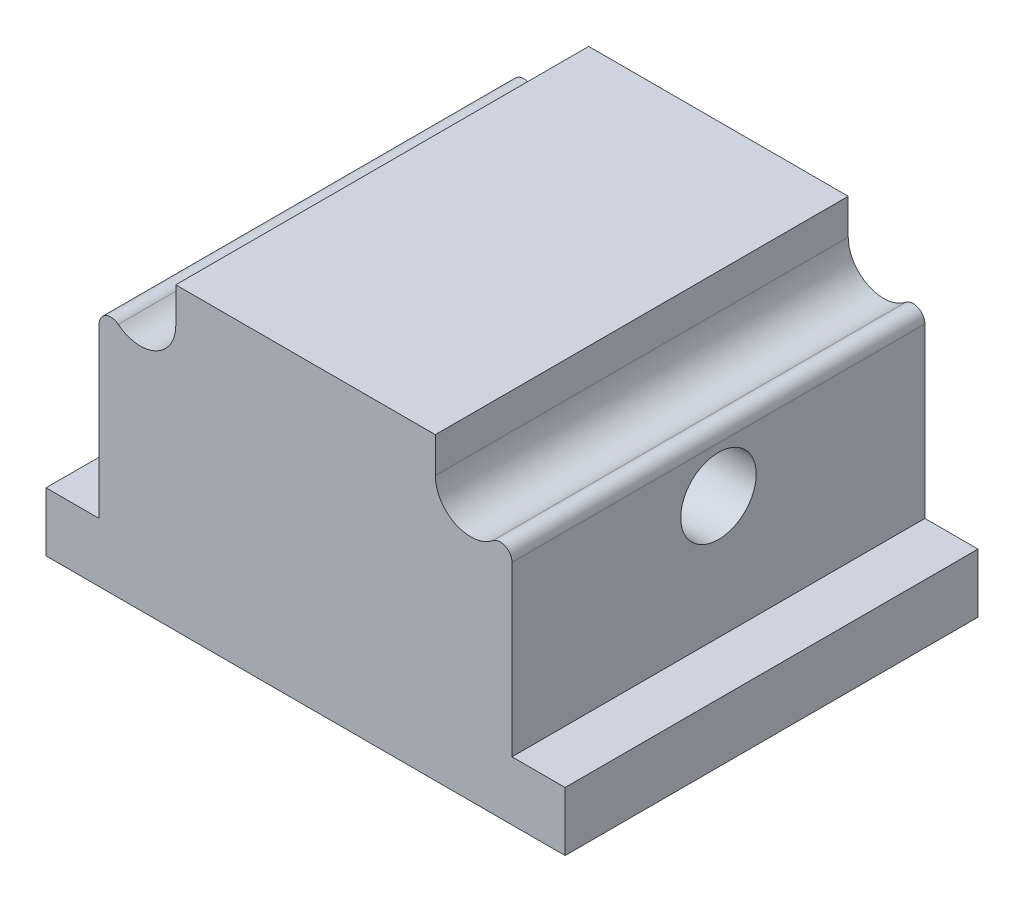
ISO-10303-21;
HEADER;
FILE_DESCRIPTION(('STEP AP214'),'2;1');
FILE_NAME('part.step','',(''),(''),'','','');
FILE_SCHEMA(('AUTOMOTIVE_DESIGN { 1 0 10303 214 1 1 1 1 }'));
ENDSEC;
DATA;
#1=APPLICATION_CONTEXT('core data for automotive mechanical design processes');
#2=APPLICATION_PROTOCOL_DEFINITION('international standard','automotive_design',2000,#1);
#3=PRODUCT_CONTEXT('',#1,'mechanical');
#4=PRODUCT('Part','Part','',(#3));
#5=PRODUCT_RELATED_PRODUCT_CATEGORY('part','',(#4));
#6=PRODUCT_DEFINITION_FORMATION('','',#4);
#7=PRODUCT_DEFINITION_CONTEXT('part definition',#1,'design');
#8=PRODUCT_DEFINITION('design','',#6,#7);
#9=PRODUCT_DEFINITION_SHAPE('','',#8);
#10=(LENGTH_UNIT() NAMED_UNIT(*) SI_UNIT(.MILLI.,.METRE.));
#11=(NAMED_UNIT(*) PLANE_ANGLE_UNIT() SI_UNIT($,.RADIAN.));
#12=(NAMED_UNIT(*) SI_UNIT($,.STERADIAN.) SOLID_ANGLE_UNIT());
#13=UNCERTAINTY_MEASURE_WITH_UNIT(LENGTH_MEASURE(1.E-05),#10,'distance_accuracy_value','');
#14=(GEOMETRIC_REPRESENTATION_CONTEXT(3) GLOBAL_UNCERTAINTY_ASSIGNED_CONTEXT((#13)) GLOBAL_UNIT_ASSIGNED_CONTEXT((#10,
#11,#12)) REPRESENTATION_CONTEXT('',''));
#15=CARTESIAN_POINT('',(0.,0.,0.));
#16=DIRECTION('',(0.,0.,1.));
#17=DIRECTION('',(1.,0.,0.));
#18=AXIS2_PLACEMENT_3D('',#15,#16,#17);
#19=CARTESIAN_POINT('',(0.,-7.7,0.));
#20=DIRECTION('',(0.,-1.,0.));
#21=DIRECTION('',(0.,0.,-1.));
#22=AXIS2_PLACEMENT_3D('',#19,#20,#21);
#23=PLANE('',#22);
#24=DIRECTION('',(0.,0.,1.));
#25=VECTOR('',#24,1.);
#26=CARTESIAN_POINT('',(11.,-7.7,8.75));
#27=LINE('',#26,#25);
#28=CARTESIAN_POINT('',(11.,-7.7,-8.75));
#29=VERTEX_POINT('',#28);
#30=CARTESIAN_POINT('',(11.,-7.7,8.75));
#31=VERTEX_POINT('',#30);
#32=EDGE_CURVE('E278',#29,#31,#27,.T.);
#33=ORIENTED_EDGE('',*,*,#32,.T.);
#34=DIRECTION('',(-1.,0.,0.));
#35=VECTOR('',#34,1.);
#36=CARTESIAN_POINT('',(-11.,-7.7,8.75));
#37=LINE('',#36,#35);
#38=CARTESIAN_POINT('',(-11.,-7.7,8.75));
#39=VERTEX_POINT('',#38);
#40=EDGE_CURVE('E281',#31,#39,#37,.T.);
#41=ORIENTED_EDGE('',*,*,#40,.T.);
#42=DIRECTION('',(0.,0.,-1.));
#43=VECTOR('',#42,1.);
#44=CARTESIAN_POINT('',(-11.,-7.7,8.75));
#45=LINE('',#44,#43);
#46=CARTESIAN_POINT('',(-11.,-7.7,-8.75));
#47=VERTEX_POINT('',#46);
#48=EDGE_CURVE('E284',#39,#47,#45,.T.);
#49=ORIENTED_EDGE('',*,*,#48,.T.);
#50=DIRECTION('',(1.,0.,0.));
#51=VECTOR('',#50,1.);
#52=CARTESIAN_POINT('',(-11.,-7.7,-8.75));
#53=LINE('',#52,#51);
#54=EDGE_CURVE('E286',#47,#29,#53,.T.);
#55=ORIENTED_EDGE('',*,*,#54,.T.);
#56=EDGE_LOOP('',(#33,#41,#49,#55));
#57=FACE_BOUND('',#56,.T.);
#58=DIRECTION('',(0.951056516295154,0.,-0.309016994374947));
#59=VECTOR('',#58,1.);
#60=CARTESIAN_POINT('',(-0.763932022500211,-7.7,-2.35114100916989));
#61=LINE('',#60,#59);
#62=CARTESIAN_POINT('',(-8.,-7.7,0.));
#63=VERTEX_POINT('',#62);
#64=CARTESIAN_POINT('',(-2.47213595499958,-7.7,-1.79611190631834));
#65=VERTEX_POINT('',#64);
#66=EDGE_CURVE('E235',#63,#65,#61,.T.);
#67=ORIENTED_EDGE('',*,*,#66,.F.);
#68=DIRECTION('',(0.951056516295154,0.,0.309016994374948));
#69=VECTOR('',#68,1.);
#70=CARTESIAN_POINT('',(-0.763932022500211,-7.7,2.35114100916989));
#71=LINE('',#70,#69);
#72=CARTESIAN_POINT('',(-2.47213595499958,-7.7,1.79611190631834));
#73=VERTEX_POINT('',#72);
#74=EDGE_CURVE('E50',#63,#73,#71,.T.);
#75=ORIENTED_EDGE('',*,*,#74,.T.);
#76=DIRECTION('',(0.,0.,-1.));
#77=VECTOR('',#76,1.);
#78=CARTESIAN_POINT('',(-2.47213595499958,-7.7,0.));
#79=LINE('',#78,#77);
#80=CARTESIAN_POINT('',(-2.47213595499958,-7.7,7.60845213036123));
#81=VERTEX_POINT('',#80);
#82=EDGE_CURVE('E212',#81,#73,#79,.T.);
#83=ORIENTED_EDGE('',*,*,#82,.F.);
#84=DIRECTION('',(0.587785252292473,0.,-0.809016994374947));
#85=VECTOR('',#84,1.);
#86=CARTESIAN_POINT('',(2.,-7.7,1.45308505601072));
#87=LINE('',#86,#85);
#88=CARTESIAN_POINT('',(0.94427190999916,-7.7,2.90617011202144));
#89=VERTEX_POINT('',#88);
#90=EDGE_CURVE('E255',#81,#89,#87,.T.);
#91=ORIENTED_EDGE('',*,*,#90,.T.);
#92=DIRECTION('',(0.951056516295154,0.,0.309016994374948));
#93=VECTOR('',#92,1.);
#94=CARTESIAN_POINT('',(-0.763932022500211,-7.7,2.35114100916989));
#95=LINE('',#94,#93);
#96=CARTESIAN_POINT('',(6.47213595499958,-7.7,4.70228201833979));
#97=VERTEX_POINT('',#96);
#98=EDGE_CURVE('E252',#89,#97,#95,.T.);
#99=ORIENTED_EDGE('',*,*,#98,.T.);
#100=DIRECTION('',(-0.587785252292473,0.,-0.809016994374948));
#101=VECTOR('',#100,1.);
#102=CARTESIAN_POINT('',(2.,-7.7,-1.45308505601072));
#103=LINE('',#102,#101);
#104=CARTESIAN_POINT('',(3.05572809000084,-7.7,0.));
#105=VERTEX_POINT('',#104);
#106=EDGE_CURVE('E249',#97,#105,#103,.T.);
#107=ORIENTED_EDGE('',*,*,#106,.T.);
#108=DIRECTION('',(0.587785252292473,0.,-0.809016994374947));
#109=VECTOR('',#108,1.);
#110=CARTESIAN_POINT('',(2.,-7.7,1.45308505601072));
#111=LINE('',#110,#109);
#112=CARTESIAN_POINT('',(6.47213595499958,-7.7,-4.70228201833979));
#113=VERTEX_POINT('',#112);
#114=EDGE_CURVE('E246',#105,#113,#111,.T.);
#115=ORIENTED_EDGE('',*,*,#114,.T.);
#116=DIRECTION('',(0.951056516295154,0.,-0.309016994374947));
#117=VECTOR('',#116,1.);
#118=CARTESIAN_POINT('',(-0.763932022500211,-7.7,-2.35114100916989));
#119=LINE('',#118,#117);
#120=CARTESIAN_POINT('',(0.944271909999159,-7.7,-2.90617011202144));
#121=VERTEX_POINT('',#120);
#122=EDGE_CURVE('E243',#121,#113,#119,.T.);
#123=ORIENTED_EDGE('',*,*,#122,.F.);
#124=DIRECTION('',(-0.587785252292473,0.,-0.809016994374948));
#125=VECTOR('',#124,1.);
#126=CARTESIAN_POINT('',(2.,-7.7,-1.45308505601072));
#127=LINE('',#126,#125);
#128=CARTESIAN_POINT('',(-2.47213595499958,-7.7,-7.60845213036123));
#129=VERTEX_POINT('',#128);
#130=EDGE_CURVE('E240',#121,#129,#127,.T.);
#131=ORIENTED_EDGE('',*,*,#130,.T.);
#132=DIRECTION('',(0.,0.,-1.));
#133=VECTOR('',#132,1.);
#134=CARTESIAN_POINT('',(-2.47213595499958,-7.7,0.));
#135=LINE('',#134,#133);
#136=EDGE_CURVE('E237',#65,#129,#135,.T.);
#137=ORIENTED_EDGE('',*,*,#136,.F.);
#138=EDGE_LOOP('',(#67,#75,#83,#91,#99,#107,#115,#123,#131,#137));
#139=FACE_BOUND('',#138,.T.);
#140=ADVANCED_FACE('F35',(#57,#139),#23,.T.);
#141=CARTESIAN_POINT('',(-8.75,5.,8.75000000000001));
#142=DIRECTION('',(1.,0.,0.));
#143=DIRECTION('',(0.,0.,-1.));
#144=AXIS2_PLACEMENT_3D('',#141,#142,#143);
#145=PLANE('',#144);
#146=CARTESIAN_POINT('',(-8.75000000000001,0.,0.));
#147=DIRECTION('',(1.,0.,0.));
#148=DIRECTION('',(0.,0.,-1.));
#149=AXIS2_PLACEMENT_3D('',#146,#147,#148);
#150=CIRCLE('',#149,1.6);
#151=CARTESIAN_POINT('',(-8.75000000000001,0.,-1.6));
#152=VERTEX_POINT('',#151);
#153=EDGE_CURVE('E368',#152,#152,#150,.T.);
#154=ORIENTED_EDGE('',*,*,#153,.T.);
#155=EDGE_LOOP('',(#154));
#156=FACE_BOUND('',#155,.T.);
#157=DIRECTION('',(0.,0.,-1.));
#158=VECTOR('',#157,1.);
#159=CARTESIAN_POINT('',(-8.75,1.9387505004004,8.75000000000001));
#160=LINE('',#159,#158);
#161=CARTESIAN_POINT('',(-8.75,1.9387505004004,8.75000000000001));
#162=VERTEX_POINT('',#161);
#163=CARTESIAN_POINT('',(-8.75000000000001,1.9387505004004,-8.75));
#164=VERTEX_POINT('',#163);
#165=EDGE_CURVE('E335',#162,#164,#160,.T.);
#166=ORIENTED_EDGE('',*,*,#165,.T.);
#167=DIRECTION('',(0.,-1.,0.));
#168=VECTOR('',#167,1.);
#169=CARTESIAN_POINT('',(-8.75000000000001,5.,-8.75));
#170=LINE('',#169,#168);
#171=CARTESIAN_POINT('',(-8.75,-5.2,-8.75));
#172=VERTEX_POINT('',#171);
#173=EDGE_CURVE('E43',#164,#172,#170,.T.);
#174=ORIENTED_EDGE('',*,*,#173,.T.);
#175=DIRECTION('',(0.,0.,-1.));
#176=VECTOR('',#175,1.);
#177=CARTESIAN_POINT('',(-8.75,-5.2,8.75000000000001));
#178=LINE('',#177,#176);
#179=CARTESIAN_POINT('',(-8.75,-5.2,8.75000000000001));
#180=VERTEX_POINT('',#179);
#181=EDGE_CURVE('E314',#180,#172,#178,.T.);
#182=ORIENTED_EDGE('',*,*,#181,.F.);
#183=DIRECTION('',(0.,-1.,0.));
#184=VECTOR('',#183,1.);
#185=CARTESIAN_POINT('',(-8.75,5.,8.75000000000001));
#186=LINE('',#185,#184);
#187=EDGE_CURVE('E381',#162,#180,#186,.T.);
#188=ORIENTED_EDGE('',*,*,#187,.F.);
#189=EDGE_LOOP('',(#166,#174,#182,#188));
#190=FACE_BOUND('',#189,.T.);
#191=ADVANCED_FACE('F385',(#156,#190),#145,.F.);
#192=CARTESIAN_POINT('',(8.75000000000001,5.,8.75));
#193=DIRECTION('',(-1.,0.,0.));
#194=DIRECTION('',(0.,0.,1.));
#195=AXIS2_PLACEMENT_3D('',#192,#193,#194);
#196=PLANE('',#195);
#197=CARTESIAN_POINT('',(8.75,0.,0.));
#198=DIRECTION('',(1.,0.,0.));
#199=DIRECTION('',(0.,0.,-1.));
#200=AXIS2_PLACEMENT_3D('',#197,#198,#199);
#201=CIRCLE('',#200,1.6);
#202=CARTESIAN_POINT('',(8.75,0.,-1.6));
#203=VERTEX_POINT('',#202);
#204=EDGE_CURVE('E338',#203,#203,#201,.T.);
#205=ORIENTED_EDGE('',*,*,#204,.F.);
#206=EDGE_LOOP('',(#205));
#207=FACE_BOUND('',#206,.T.);
#208=DIRECTION('',(0.,-1.,0.));
#209=VECTOR('',#208,1.);
#210=CARTESIAN_POINT('',(8.75,5.,-8.75));
#211=LINE('',#210,#209);
#212=CARTESIAN_POINT('',(8.75,1.9387505004004,-8.75000000000001));
#213=VERTEX_POINT('',#212);
#214=CARTESIAN_POINT('',(8.75,-5.2,-8.75));
#215=VERTEX_POINT('',#214);
#216=EDGE_CURVE('E11',#213,#215,#211,.T.);
#217=ORIENTED_EDGE('',*,*,#216,.F.);
#218=DIRECTION('',(0.,0.,-1.));
#219=VECTOR('',#218,1.);
#220=CARTESIAN_POINT('',(8.75000000000001,1.9387505004004,8.75000000000001));
#221=LINE('',#220,#219);
#222=CARTESIAN_POINT('',(8.75000000000001,1.9387505004004,8.75000000000001));
#223=VERTEX_POINT('',#222);
#224=EDGE_CURVE('E331',#223,#213,#221,.T.);
#225=ORIENTED_EDGE('',*,*,#224,.F.);
#226=DIRECTION('',(0.,-1.,0.));
#227=VECTOR('',#226,1.);
#228=CARTESIAN_POINT('',(8.75000000000001,5.,8.75));
#229=LINE('',#228,#227);
#230=CARTESIAN_POINT('',(8.75000000000001,-5.2,8.75));
#231=VERTEX_POINT('',#230);
#232=EDGE_CURVE('E379',#223,#231,#229,.T.);
#233=ORIENTED_EDGE('',*,*,#232,.T.);
#234=DIRECTION('',(0.,0.,1.));
#235=VECTOR('',#234,1.);
#236=CARTESIAN_POINT('',(8.75,-5.2,-8.75));
#237=LINE('',#236,#235);
#238=EDGE_CURVE('E311',#215,#231,#237,.T.);
#239=ORIENTED_EDGE('',*,*,#238,.F.);
#240=EDGE_LOOP('',(#217,#225,#233,#239));
#241=FACE_BOUND('',#240,.T.);
#242=ADVANCED_FACE('F37',(#207,#241),#196,.F.);
#243=CARTESIAN_POINT('',(-8.75000000000001,5.,-8.75));
#244=DIRECTION('',(0.,0.,1.));
#245=DIRECTION('',(1.,0.,0.));
#246=AXIS2_PLACEMENT_3D('',#243,#244,#245);
#247=PLANE('',#246);
#248=ORIENTED_EDGE('',*,*,#173,.F.);
#249=CARTESIAN_POINT('',(-8.25,1.9387505004004,-8.75));
#250=DIRECTION('',(0.,0.,1.));
#251=DIRECTION('',(1.,0.,0.));
#252=AXIS2_PLACEMENT_3D('',#249,#250,#251);
#253=CIRCLE('',#252,0.500000000000002);
#254=CARTESIAN_POINT('',(-7.9375,2.3290628753003,-8.75));
#255=VERTEX_POINT('',#254);
#256=EDGE_CURVE('E320',#255,#164,#253,.T.);
#257=ORIENTED_EDGE('',*,*,#256,.F.);
#258=CARTESIAN_POINT('',(-7.,3.5,-8.75));
#259=DIRECTION('',(0.,0.,-1.));
#260=DIRECTION('',(-1.,0.,0.));
#261=AXIS2_PLACEMENT_3D('',#258,#259,#260);
#262=CIRCLE('',#261,1.5);
#263=CARTESIAN_POINT('',(-5.5,3.5,-8.75));
#264=VERTEX_POINT('',#263);
#265=EDGE_CURVE('E330',#264,#255,#262,.T.);
#266=ORIENTED_EDGE('',*,*,#265,.F.);
#267=DIRECTION('',(0.,-1.,0.));
#268=VECTOR('',#267,1.);
#269=CARTESIAN_POINT('',(-5.5,3.5,-8.75));
#270=LINE('',#269,#268);
#271=CARTESIAN_POINT('',(-5.5,5.,-8.75));
#272=VERTEX_POINT('',#271);
#273=EDGE_CURVE('E327',#272,#264,#270,.T.);
#274=ORIENTED_EDGE('',*,*,#273,.F.);
#275=DIRECTION('',(-1.,0.,0.));
#276=VECTOR('',#275,1.);
#277=CARTESIAN_POINT('',(-8.75000000000001,5.,-8.75));
#278=LINE('',#277,#276);
#279=CARTESIAN_POINT('',(5.5,5.,-8.75));
#280=VERTEX_POINT('',#279);
#281=EDGE_CURVE('E371',#280,#272,#278,.T.);
#282=ORIENTED_EDGE('',*,*,#281,.F.);
#283=DIRECTION('',(0.,1.,0.));
#284=VECTOR('',#283,1.);
#285=CARTESIAN_POINT('',(5.5,3.5,-8.75));
#286=LINE('',#285,#284);
#287=CARTESIAN_POINT('',(5.5,3.5,-8.75));
#288=VERTEX_POINT('',#287);
#289=EDGE_CURVE('E348',#288,#280,#286,.T.);
#290=ORIENTED_EDGE('',*,*,#289,.F.);
#291=CARTESIAN_POINT('',(7.,3.5,-8.75));
#292=DIRECTION('',(0.,0.,-1.));
#293=DIRECTION('',(1.,0.,0.));
#294=AXIS2_PLACEMENT_3D('',#291,#292,#293);
#295=CIRCLE('',#294,1.5);
#296=CARTESIAN_POINT('',(7.9375,2.3290628753003,-8.75));
#297=VERTEX_POINT('',#296);
#298=EDGE_CURVE('E357',#297,#288,#295,.T.);
#299=ORIENTED_EDGE('',*,*,#298,.F.);
#300=CARTESIAN_POINT('',(8.25,1.9387505004004,-8.75));
#301=DIRECTION('',(0.,0.,1.));
#302=DIRECTION('',(-1.,0.,0.));
#303=AXIS2_PLACEMENT_3D('',#300,#301,#302);
#304=CIRCLE('',#303,0.500000000000002);
#305=EDGE_CURVE('E317',#213,#297,#304,.T.);
#306=ORIENTED_EDGE('',*,*,#305,.F.);
#307=ORIENTED_EDGE('',*,*,#216,.T.);
#308=DIRECTION('',(1.,0.,0.));
#309=VECTOR('',#308,1.);
#310=CARTESIAN_POINT('',(-11.,-5.2,-8.75));
#311=LINE('',#310,#309);
#312=CARTESIAN_POINT('',(11.,-5.2,-8.75));
#313=VERTEX_POINT('',#312);
#314=EDGE_CURVE('E297',#215,#313,#311,.T.);
#315=ORIENTED_EDGE('',*,*,#314,.T.);
#316=DIRECTION('',(0.,1.,0.));
#317=VECTOR('',#316,1.);
#318=CARTESIAN_POINT('',(11.,-7.7,-8.75));
#319=LINE('',#318,#317);
#320=EDGE_CURVE('E288',#29,#313,#319,.T.);
#321=ORIENTED_EDGE('',*,*,#320,.F.);
#322=ORIENTED_EDGE('',*,*,#54,.F.);
#323=DIRECTION('',(0.,1.,0.));
#324=VECTOR('',#323,1.);
#325=CARTESIAN_POINT('',(-11.,-7.7,-8.75));
#326=LINE('',#325,#324);
#327=CARTESIAN_POINT('',(-11.,-5.2,-8.75));
#328=VERTEX_POINT('',#327);
#329=EDGE_CURVE('E302',#47,#328,#326,.T.);
#330=ORIENTED_EDGE('',*,*,#329,.T.);
#331=EDGE_CURVE('E282',#328,#172,#311,.T.);
#332=ORIENTED_EDGE('',*,*,#331,.T.);
#333=EDGE_LOOP('',(#248,#257,#266,#274,#282,#290,#299,#306,#307,#315,#321,#322,#330,#332));
#334=FACE_BOUND('',#333,.T.);
#335=ADVANCED_FACE('F394',(#334),#247,.F.);
#336=CARTESIAN_POINT('',(-8.75,5.,8.75000000000001));
#337=DIRECTION('',(0.,0.,-1.));
#338=DIRECTION('',(-1.,0.,0.));
#339=AXIS2_PLACEMENT_3D('',#336,#337,#338);
#340=PLANE('',#339);
#341=CARTESIAN_POINT('',(-7.,3.5,8.75000000000001));
#342=DIRECTION('',(0.,0.,-1.));
#343=DIRECTION('',(-1.,0.,0.));
#344=AXIS2_PLACEMENT_3D('',#341,#342,#343);
#345=CIRCLE('',#344,1.5);
#346=CARTESIAN_POINT('',(-5.5,3.5,8.75000000000001));
#347=VERTEX_POINT('',#346);
#348=CARTESIAN_POINT('',(-7.9375,2.3290628753003,8.75000000000001));
#349=VERTEX_POINT('',#348);
#350=EDGE_CURVE('E319',#347,#349,#345,.T.);
#351=ORIENTED_EDGE('',*,*,#350,.T.);
#352=CARTESIAN_POINT('',(-8.25,1.9387505004004,8.75000000000001));
#353=DIRECTION('',(0.,0.,1.));
#354=DIRECTION('',(1.,0.,0.));
#355=AXIS2_PLACEMENT_3D('',#352,#353,#354);
#356=CIRCLE('',#355,0.500000000000002);
#357=EDGE_CURVE('E323',#349,#162,#356,.T.);
#358=ORIENTED_EDGE('',*,*,#357,.T.);
#359=ORIENTED_EDGE('',*,*,#187,.T.);
#360=DIRECTION('',(-1.,0.,0.));
#361=VECTOR('',#360,1.);
#362=CARTESIAN_POINT('',(-11.,-5.2,8.75));
#363=LINE('',#362,#361);
#364=CARTESIAN_POINT('',(-11.,-5.2,8.75));
#365=VERTEX_POINT('',#364);
#366=EDGE_CURVE('E291',#180,#365,#363,.T.);
#367=ORIENTED_EDGE('',*,*,#366,.T.);
#368=DIRECTION('',(0.,1.,0.));
#369=VECTOR('',#368,1.);
#370=CARTESIAN_POINT('',(-11.,-7.7,8.75));
#371=LINE('',#370,#369);
#372=EDGE_CURVE('E305',#39,#365,#371,.T.);
#373=ORIENTED_EDGE('',*,*,#372,.F.);
#374=ORIENTED_EDGE('',*,*,#40,.F.);
#375=DIRECTION('',(0.,1.,0.));
#376=VECTOR('',#375,1.);
#377=CARTESIAN_POINT('',(11.,-7.7,8.75));
#378=LINE('',#377,#376);
#379=CARTESIAN_POINT('',(11.,-5.2,8.75));
#380=VERTEX_POINT('',#379);
#381=EDGE_CURVE('E308',#31,#380,#378,.T.);
#382=ORIENTED_EDGE('',*,*,#381,.T.);
#383=EDGE_CURVE('E292',#380,#231,#363,.T.);
#384=ORIENTED_EDGE('',*,*,#383,.T.);
#385=ORIENTED_EDGE('',*,*,#232,.F.);
#386=CARTESIAN_POINT('',(8.25,1.9387505004004,8.75000000000001));
#387=DIRECTION('',(0.,0.,1.));
#388=DIRECTION('',(-1.,0.,0.));
#389=AXIS2_PLACEMENT_3D('',#386,#387,#388);
#390=CIRCLE('',#389,0.500000000000002);
#391=CARTESIAN_POINT('',(7.9375,2.3290628753003,8.75000000000001));
#392=VERTEX_POINT('',#391);
#393=EDGE_CURVE('E344',#223,#392,#390,.T.);
#394=ORIENTED_EDGE('',*,*,#393,.T.);
#395=CARTESIAN_POINT('',(7.,3.5,8.75000000000001));
#396=DIRECTION('',(0.,0.,-1.));
#397=DIRECTION('',(1.,0.,0.));
#398=AXIS2_PLACEMENT_3D('',#395,#396,#397);
#399=CIRCLE('',#398,1.5);
#400=CARTESIAN_POINT('',(5.5,3.5,8.75000000000001));
#401=VERTEX_POINT('',#400);
#402=EDGE_CURVE('E347',#392,#401,#399,.T.);
#403=ORIENTED_EDGE('',*,*,#402,.T.);
#404=DIRECTION('',(0.,1.,0.));
#405=VECTOR('',#404,1.);
#406=CARTESIAN_POINT('',(5.5,3.5,8.75000000000001));
#407=LINE('',#406,#405);
#408=CARTESIAN_POINT('',(5.5,5.,8.75000000000001));
#409=VERTEX_POINT('',#408);
#410=EDGE_CURVE('E351',#401,#409,#407,.T.);
#411=ORIENTED_EDGE('',*,*,#410,.T.);
#412=DIRECTION('',(1.,0.,0.));
#413=VECTOR('',#412,1.);
#414=CARTESIAN_POINT('',(-8.75,5.,8.75000000000001));
#415=LINE('',#414,#413);
#416=CARTESIAN_POINT('',(-5.5,5.,8.75000000000001));
#417=VERTEX_POINT('',#416);
#418=EDGE_CURVE('E376',#417,#409,#415,.T.);
#419=ORIENTED_EDGE('',*,*,#418,.F.);
#420=DIRECTION('',(0.,-1.,0.));
#421=VECTOR('',#420,1.);
#422=CARTESIAN_POINT('',(-5.5,3.5,8.75000000000001));
#423=LINE('',#422,#421);
#424=EDGE_CURVE('E58',#417,#347,#423,.T.);
#425=ORIENTED_EDGE('',*,*,#424,.T.);
#426=EDGE_LOOP('',(#351,#358,#359,#367,#373,#374,#382,#384,#385,#394,#403,#411,#419,#425));
#427=FACE_BOUND('',#426,.T.);
#428=ADVANCED_FACE('F403',(#427),#340,.F.);
#429=CARTESIAN_POINT('',(0.,5.,0.));
#430=DIRECTION('',(0.,-1.,0.));
#431=DIRECTION('',(0.,0.,-1.));
#432=AXIS2_PLACEMENT_3D('',#429,#430,#431);
#433=PLANE('',#432);
#434=ORIENTED_EDGE('',*,*,#281,.T.);
#435=DIRECTION('',(0.,0.,-1.));
#436=VECTOR('',#435,1.);
#437=CARTESIAN_POINT('',(-5.5,5.,8.75000000000001));
#438=LINE('',#437,#436);
#439=EDGE_CURVE('E326',#417,#272,#438,.T.);
#440=ORIENTED_EDGE('',*,*,#439,.F.);
#441=ORIENTED_EDGE('',*,*,#418,.T.);
#442=DIRECTION('',(0.,0.,-1.));
#443=VECTOR('',#442,1.);
#444=CARTESIAN_POINT('',(5.5,5.,8.75000000000001));
#445=LINE('',#444,#443);
#446=EDGE_CURVE('E362',#409,#280,#445,.T.);
#447=ORIENTED_EDGE('',*,*,#446,.T.);
#448=EDGE_LOOP('',(#434,#440,#441,#447));
#449=FACE_BOUND('',#448,.T.);
#450=ADVANCED_FACE('F416',(#449),#433,.F.);
#451=CARTESIAN_POINT('',(-8.75000000000001,0.,0.));
#452=DIRECTION('',(1.,0.,0.));
#453=DIRECTION('',(0.,0.,-1.));
#454=AXIS2_PLACEMENT_3D('',#451,#452,#453);
#455=CYLINDRICAL_SURFACE('',#454,1.6);
#456=ORIENTED_EDGE('',*,*,#153,.F.);
#457=EDGE_LOOP('',(#456));
#458=FACE_BOUND('',#457,.T.);
#459=ORIENTED_EDGE('',*,*,#204,.T.);
#460=EDGE_LOOP('',(#459));
#461=FACE_BOUND('',#460,.T.);
#462=ADVANCED_FACE('F521',(#458,#461),#455,.F.);
#463=CARTESIAN_POINT('',(8.25,1.9387505004004,8.75000000000001));
#464=DIRECTION('',(0.,0.,-1.));
#465=DIRECTION('',(-1.,0.,0.));
#466=AXIS2_PLACEMENT_3D('',#463,#464,#465);
#467=CYLINDRICAL_SURFACE('',#466,0.500000000000002);
#468=ORIENTED_EDGE('',*,*,#305,.T.);
#469=DIRECTION('',(0.,0.,-1.));
#470=VECTOR('',#469,1.);
#471=CARTESIAN_POINT('',(7.9375,2.3290628753003,8.75000000000001));
#472=LINE('',#471,#470);
#473=EDGE_CURVE('E354',#392,#297,#472,.T.);
#474=ORIENTED_EDGE('',*,*,#473,.F.);
#475=ORIENTED_EDGE('',*,*,#393,.F.);
#476=ORIENTED_EDGE('',*,*,#224,.T.);
#477=EDGE_LOOP('',(#468,#474,#475,#476));
#478=FACE_BOUND('',#477,.T.);
#479=ADVANCED_FACE('F428',(#478),#467,.T.);
#480=CARTESIAN_POINT('',(5.5,3.5,8.75000000000001));
#481=DIRECTION('',(-1.,0.,0.));
#482=DIRECTION('',(0.,0.,1.));
#483=AXIS2_PLACEMENT_3D('',#480,#481,#482);
#484=PLANE('',#483);
#485=ORIENTED_EDGE('',*,*,#289,.T.);
#486=ORIENTED_EDGE('',*,*,#446,.F.);
#487=ORIENTED_EDGE('',*,*,#410,.F.);
#488=DIRECTION('',(0.,0.,-1.));
#489=VECTOR('',#488,1.);
#490=CARTESIAN_POINT('',(5.5,3.5,8.75000000000001));
#491=LINE('',#490,#489);
#492=EDGE_CURVE('E365',#401,#288,#491,.T.);
#493=ORIENTED_EDGE('',*,*,#492,.T.);
#494=EDGE_LOOP('',(#485,#486,#487,#493));
#495=FACE_BOUND('',#494,.T.);
#496=ADVANCED_FACE('F420',(#495),#484,.F.);
#497=CARTESIAN_POINT('',(7.,3.5,8.75000000000001));
#498=DIRECTION('',(0.,0.,-1.));
#499=DIRECTION('',(-1.,0.,0.));
#500=AXIS2_PLACEMENT_3D('',#497,#498,#499);
#501=CYLINDRICAL_SURFACE('',#500,1.5);
#502=ORIENTED_EDGE('',*,*,#298,.T.);
#503=ORIENTED_EDGE('',*,*,#492,.F.);
#504=ORIENTED_EDGE('',*,*,#402,.F.);
#505=ORIENTED_EDGE('',*,*,#473,.T.);
#506=EDGE_LOOP('',(#502,#503,#504,#505));
#507=FACE_BOUND('',#506,.T.);
#508=ADVANCED_FACE('F426',(#507),#501,.F.);
#509=CARTESIAN_POINT('',(-8.25,1.9387505004004,8.75000000000001));
#510=DIRECTION('',(0.,0.,-1.));
#511=DIRECTION('',(-1.,0.,0.));
#512=AXIS2_PLACEMENT_3D('',#509,#510,#511);
#513=CYLINDRICAL_SURFACE('',#512,0.500000000000002);
#514=ORIENTED_EDGE('',*,*,#256,.T.);
#515=ORIENTED_EDGE('',*,*,#165,.F.);
#516=ORIENTED_EDGE('',*,*,#357,.F.);
#517=DIRECTION('',(0.,0.,-1.));
#518=VECTOR('',#517,1.);
#519=CARTESIAN_POINT('',(-7.9375,2.3290628753003,8.75000000000001));
#520=LINE('',#519,#518);
#521=EDGE_CURVE('E339',#349,#255,#520,.T.);
#522=ORIENTED_EDGE('',*,*,#521,.T.);
#523=EDGE_LOOP('',(#514,#515,#516,#522));
#524=FACE_BOUND('',#523,.T.);
#525=ADVANCED_FACE('F407',(#524),#513,.T.);
#526=CARTESIAN_POINT('',(-7.,3.5,8.75000000000001));
#527=DIRECTION('',(0.,0.,-1.));
#528=DIRECTION('',(-1.,0.,0.));
#529=AXIS2_PLACEMENT_3D('',#526,#527,#528);
#530=CYLINDRICAL_SURFACE('',#529,1.5);
#531=ORIENTED_EDGE('',*,*,#265,.T.);
#532=ORIENTED_EDGE('',*,*,#521,.F.);
#533=ORIENTED_EDGE('',*,*,#350,.F.);
#534=DIRECTION('',(0.,0.,-1.));
#535=VECTOR('',#534,1.);
#536=CARTESIAN_POINT('',(-5.5,3.5,8.75000000000001));
#537=LINE('',#536,#535);
#538=EDGE_CURVE('E341',#347,#264,#537,.T.);
#539=ORIENTED_EDGE('',*,*,#538,.T.);
#540=EDGE_LOOP('',(#531,#532,#533,#539));
#541=FACE_BOUND('',#540,.T.);
#542=ADVANCED_FACE('F412',(#541),#530,.F.);
#543=CARTESIAN_POINT('',(-5.5,3.5,8.75000000000001));
#544=DIRECTION('',(1.,0.,0.));
#545=DIRECTION('',(0.,1.,0.));
#546=AXIS2_PLACEMENT_3D('',#543,#544,#545);
#547=PLANE('',#546);
#548=ORIENTED_EDGE('',*,*,#273,.T.);
#549=ORIENTED_EDGE('',*,*,#538,.F.);
#550=ORIENTED_EDGE('',*,*,#424,.F.);
#551=ORIENTED_EDGE('',*,*,#439,.T.);
#552=EDGE_LOOP('',(#548,#549,#550,#551));
#553=FACE_BOUND('',#552,.T.);
#554=ADVANCED_FACE('F413',(#553),#547,.F.);
#555=CARTESIAN_POINT('',(0.,-5.2,0.));
#556=DIRECTION('',(0.,-1.,0.));
#557=DIRECTION('',(0.,0.,-1.));
#558=AXIS2_PLACEMENT_3D('',#555,#556,#557);
#559=PLANE('',#558);
#560=ORIENTED_EDGE('',*,*,#314,.F.);
#561=ORIENTED_EDGE('',*,*,#238,.T.);
#562=ORIENTED_EDGE('',*,*,#383,.F.);
#563=DIRECTION('',(0.,0.,1.));
#564=VECTOR('',#563,1.);
#565=CARTESIAN_POINT('',(11.,-5.2,8.75));
#566=LINE('',#565,#564);
#567=EDGE_CURVE('E262',#313,#380,#566,.T.);
#568=ORIENTED_EDGE('',*,*,#567,.F.);
#569=EDGE_LOOP('',(#560,#561,#562,#568));
#570=FACE_BOUND('',#569,.T.);
#571=ADVANCED_FACE('F437',(#570),#559,.F.);
#572=ORIENTED_EDGE('',*,*,#366,.F.);
#573=ORIENTED_EDGE('',*,*,#181,.T.);
#574=ORIENTED_EDGE('',*,*,#331,.F.);
#575=DIRECTION('',(0.,0.,-1.));
#576=VECTOR('',#575,1.);
#577=CARTESIAN_POINT('',(-11.,-5.2,8.75));
#578=LINE('',#577,#576);
#579=EDGE_CURVE('E295',#365,#328,#578,.T.);
#580=ORIENTED_EDGE('',*,*,#579,.F.);
#581=EDGE_LOOP('',(#572,#573,#574,#580));
#582=FACE_BOUND('',#581,.T.);
#583=ADVANCED_FACE('F392',(#582),#559,.F.);
#584=CARTESIAN_POINT('',(11.,-7.7,8.75));
#585=DIRECTION('',(-1.,0.,0.));
#586=DIRECTION('',(0.,0.,1.));
#587=AXIS2_PLACEMENT_3D('',#584,#585,#586);
#588=PLANE('',#587);
#589=ORIENTED_EDGE('',*,*,#567,.T.);
#590=ORIENTED_EDGE('',*,*,#381,.F.);
#591=ORIENTED_EDGE('',*,*,#32,.F.);
#592=ORIENTED_EDGE('',*,*,#320,.T.);
#593=EDGE_LOOP('',(#589,#590,#591,#592));
#594=FACE_BOUND('',#593,.T.);
#595=ADVANCED_FACE('F440',(#594),#588,.F.);
#596=CARTESIAN_POINT('',(-11.,-7.7,8.75));
#597=DIRECTION('',(1.,0.,0.));
#598=DIRECTION('',(0.,0.,-1.));
#599=AXIS2_PLACEMENT_3D('',#596,#597,#598);
#600=PLANE('',#599);
#601=ORIENTED_EDGE('',*,*,#579,.T.);
#602=ORIENTED_EDGE('',*,*,#329,.F.);
#603=ORIENTED_EDGE('',*,*,#48,.F.);
#604=ORIENTED_EDGE('',*,*,#372,.T.);
#605=EDGE_LOOP('',(#601,#602,#603,#604));
#606=FACE_BOUND('',#605,.T.);
#607=ADVANCED_FACE('F400',(#606),#600,.F.);
#608=CARTESIAN_POINT('',(-0.763932022500211,-6.2,2.35114100916989));
#609=DIRECTION('',(0.309016994374948,0.,-0.951056516295153));
#610=DIRECTION('',(-0.951056516295154,0.,-0.309016994374948));
#611=AXIS2_PLACEMENT_3D('',#608,#609,#610);
#612=PLANE('',#611);
#613=ORIENTED_EDGE('',*,*,#74,.F.);
#614=DIRECTION('',(0.,-1.,0.));
#615=VECTOR('',#614,1.);
#616=CARTESIAN_POINT('',(-8.,-6.2,0.));
#617=LINE('',#616,#615);
#618=CARTESIAN_POINT('',(-8.,-6.2,0.));
#619=VERTEX_POINT('',#618);
#620=EDGE_CURVE('E192',#619,#63,#617,.T.);
#621=ORIENTED_EDGE('',*,*,#620,.F.);
#622=DIRECTION('',(0.951056516295154,0.,0.309016994374948));
#623=VECTOR('',#622,1.);
#624=CARTESIAN_POINT('',(-0.763932022500211,-6.2,2.35114100916989));
#625=LINE('',#624,#623);
#626=CARTESIAN_POINT('',(-2.47213595499958,-6.2,1.79611190631834));
#627=VERTEX_POINT('',#626);
#628=EDGE_CURVE('E195',#619,#627,#625,.T.);
#629=ORIENTED_EDGE('',*,*,#628,.T.);
#630=DIRECTION('',(0.,-1.,0.));
#631=VECTOR('',#630,1.);
#632=CARTESIAN_POINT('',(-2.47213595499958,-6.2,1.79611190631834));
#633=LINE('',#632,#631);
#634=EDGE_CURVE('E260',#627,#73,#633,.T.);
#635=ORIENTED_EDGE('',*,*,#634,.T.);
#636=EDGE_LOOP('',(#613,#621,#629,#635));
#637=FACE_BOUND('',#636,.T.);
#638=ADVANCED_FACE('F194',(#637),#612,.T.);
#639=CARTESIAN_POINT('',(-2.47213595499958,-6.2,0.));
#640=DIRECTION('',(-1.,0.,0.));
#641=DIRECTION('',(0.,0.,1.));
#642=AXIS2_PLACEMENT_3D('',#639,#640,#641);
#643=PLANE('',#642);
#644=ORIENTED_EDGE('',*,*,#82,.T.);
#645=ORIENTED_EDGE('',*,*,#634,.F.);
#646=DIRECTION('',(0.,0.,-1.));
#647=VECTOR('',#646,1.);
#648=CARTESIAN_POINT('',(-2.47213595499958,-6.2,0.));
#649=LINE('',#648,#647);
#650=CARTESIAN_POINT('',(-2.47213595499958,-6.2,7.60845213036123));
#651=VERTEX_POINT('',#650);
#652=EDGE_CURVE('E202',#651,#627,#649,.T.);
#653=ORIENTED_EDGE('',*,*,#652,.F.);
#654=DIRECTION('',(0.,-1.,0.));
#655=VECTOR('',#654,1.);
#656=CARTESIAN_POINT('',(-2.47213595499958,-6.2,7.60845213036123));
#657=LINE('',#656,#655);
#658=EDGE_CURVE('E263',#651,#81,#657,.T.);
#659=ORIENTED_EDGE('',*,*,#658,.T.);
#660=EDGE_LOOP('',(#644,#645,#653,#659));
#661=FACE_BOUND('',#660,.T.);
#662=ADVANCED_FACE('F477',(#661),#643,.F.);
#663=CARTESIAN_POINT('',(2.,-6.2,1.45308505601072));
#664=DIRECTION('',(-0.809016994374947,0.,-0.587785252292473));
#665=DIRECTION('',(-0.587785252292473,0.,0.809016994374948));
#666=AXIS2_PLACEMENT_3D('',#663,#664,#665);
#667=PLANE('',#666);
#668=ORIENTED_EDGE('',*,*,#90,.F.);
#669=ORIENTED_EDGE('',*,*,#658,.F.);
#670=DIRECTION('',(0.587785252292473,0.,-0.809016994374947));
#671=VECTOR('',#670,1.);
#672=CARTESIAN_POINT('',(2.,-6.2,1.45308505601072));
#673=LINE('',#672,#671);
#674=CARTESIAN_POINT('',(0.94427190999916,-6.2,2.90617011202144));
#675=VERTEX_POINT('',#674);
#676=EDGE_CURVE('E231',#651,#675,#673,.T.);
#677=ORIENTED_EDGE('',*,*,#676,.T.);
#678=DIRECTION('',(0.,-1.,0.));
#679=VECTOR('',#678,1.);
#680=CARTESIAN_POINT('',(0.94427190999916,-6.2,2.90617011202144));
#681=LINE('',#680,#679);
#682=EDGE_CURVE('E265',#675,#89,#681,.T.);
#683=ORIENTED_EDGE('',*,*,#682,.T.);
#684=EDGE_LOOP('',(#668,#669,#677,#683));
#685=FACE_BOUND('',#684,.T.);
#686=ADVANCED_FACE('F475',(#685),#667,.T.);
#687=CARTESIAN_POINT('',(-0.763932022500211,-6.2,2.35114100916989));
#688=DIRECTION('',(0.309016994374948,0.,-0.951056516295153));
#689=DIRECTION('',(-0.951056516295154,0.,-0.309016994374948));
#690=AXIS2_PLACEMENT_3D('',#687,#688,#689);
#691=PLANE('',#690);
#692=ORIENTED_EDGE('',*,*,#98,.F.);
#693=ORIENTED_EDGE('',*,*,#682,.F.);
#694=DIRECTION('',(0.951056516295154,0.,0.309016994374948));
#695=VECTOR('',#694,1.);
#696=CARTESIAN_POINT('',(-0.763932022500211,-6.2,2.35114100916989));
#697=LINE('',#696,#695);
#698=CARTESIAN_POINT('',(6.47213595499958,-6.2,4.70228201833979));
#699=VERTEX_POINT('',#698);
#700=EDGE_CURVE('E229',#675,#699,#697,.T.);
#701=ORIENTED_EDGE('',*,*,#700,.T.);
#702=DIRECTION('',(0.,-1.,0.));
#703=VECTOR('',#702,1.);
#704=CARTESIAN_POINT('',(6.47213595499958,-6.2,4.70228201833979));
#705=LINE('',#704,#703);
#706=EDGE_CURVE('E267',#699,#97,#705,.T.);
#707=ORIENTED_EDGE('',*,*,#706,.T.);
#708=EDGE_LOOP('',(#692,#693,#701,#707));
#709=FACE_BOUND('',#708,.T.);
#710=ADVANCED_FACE('F471',(#709),#691,.T.);
#711=CARTESIAN_POINT('',(2.,-6.2,-1.45308505601072));
#712=DIRECTION('',(-0.809016994374947,0.,0.587785252292473));
#713=DIRECTION('',(0.587785252292473,0.,0.809016994374947));
#714=AXIS2_PLACEMENT_3D('',#711,#712,#713);
#715=PLANE('',#714);
#716=ORIENTED_EDGE('',*,*,#106,.F.);
#717=ORIENTED_EDGE('',*,*,#706,.F.);
#718=DIRECTION('',(-0.587785252292473,0.,-0.809016994374948));
#719=VECTOR('',#718,1.);
#720=CARTESIAN_POINT('',(2.,-6.2,-1.45308505601072));
#721=LINE('',#720,#719);
#722=CARTESIAN_POINT('',(3.05572809000084,-6.2,0.));
#723=VERTEX_POINT('',#722);
#724=EDGE_CURVE('E227',#699,#723,#721,.T.);
#725=ORIENTED_EDGE('',*,*,#724,.T.);
#726=DIRECTION('',(0.,-1.,0.));
#727=VECTOR('',#726,1.);
#728=CARTESIAN_POINT('',(3.05572809000084,-6.2,0.));
#729=LINE('',#728,#727);
#730=EDGE_CURVE('E269',#723,#105,#729,.T.);
#731=ORIENTED_EDGE('',*,*,#730,.T.);
#732=EDGE_LOOP('',(#716,#717,#725,#731));
#733=FACE_BOUND('',#732,.T.);
#734=ADVANCED_FACE('F468',(#733),#715,.T.);
#735=CARTESIAN_POINT('',(2.,-6.2,1.45308505601072));
#736=DIRECTION('',(-0.809016994374947,0.,-0.587785252292473));
#737=DIRECTION('',(-0.587785252292473,0.,0.809016994374948));
#738=AXIS2_PLACEMENT_3D('',#735,#736,#737);
#739=PLANE('',#738);
#740=ORIENTED_EDGE('',*,*,#114,.F.);
#741=ORIENTED_EDGE('',*,*,#730,.F.);
#742=DIRECTION('',(0.587785252292473,0.,-0.809016994374947));
#743=VECTOR('',#742,1.);
#744=CARTESIAN_POINT('',(2.,-6.2,1.45308505601072));
#745=LINE('',#744,#743);
#746=CARTESIAN_POINT('',(6.47213595499958,-6.2,-4.70228201833979));
#747=VERTEX_POINT('',#746);
#748=EDGE_CURVE('E225',#723,#747,#745,.T.);
#749=ORIENTED_EDGE('',*,*,#748,.T.);
#750=DIRECTION('',(0.,-1.,0.));
#751=VECTOR('',#750,1.);
#752=CARTESIAN_POINT('',(6.47213595499958,-6.2,-4.70228201833979));
#753=LINE('',#752,#751);
#754=EDGE_CURVE('E271',#747,#113,#753,.T.);
#755=ORIENTED_EDGE('',*,*,#754,.T.);
#756=EDGE_LOOP('',(#740,#741,#749,#755));
#757=FACE_BOUND('',#756,.T.);
#758=ADVANCED_FACE('F461',(#757),#739,.T.);
#759=CARTESIAN_POINT('',(-0.763932022500211,-6.2,-2.35114100916989));
#760=DIRECTION('',(-0.309016994374947,0.,-0.951056516295154));
#761=DIRECTION('',(-0.951056516295154,0.,0.309016994374947));
#762=AXIS2_PLACEMENT_3D('',#759,#760,#761);
#763=PLANE('',#762);
#764=ORIENTED_EDGE('',*,*,#122,.T.);
#765=ORIENTED_EDGE('',*,*,#754,.F.);
#766=DIRECTION('',(0.951056516295154,0.,-0.309016994374947));
#767=VECTOR('',#766,1.);
#768=CARTESIAN_POINT('',(-0.763932022500211,-6.2,-2.35114100916989));
#769=LINE('',#768,#767);
#770=CARTESIAN_POINT('',(0.944271909999159,-6.2,-2.90617011202144));
#771=VERTEX_POINT('',#770);
#772=EDGE_CURVE('E222',#771,#747,#769,.T.);
#773=ORIENTED_EDGE('',*,*,#772,.F.);
#774=DIRECTION('',(0.,-1.,0.));
#775=VECTOR('',#774,1.);
#776=CARTESIAN_POINT('',(0.944271909999159,-6.2,-2.90617011202144));
#777=LINE('',#776,#775);
#778=EDGE_CURVE('E273',#771,#121,#777,.T.);
#779=ORIENTED_EDGE('',*,*,#778,.T.);
#780=EDGE_LOOP('',(#764,#765,#773,#779));
#781=FACE_BOUND('',#780,.T.);
#782=ADVANCED_FACE('F458',(#781),#763,.F.);
#783=CARTESIAN_POINT('',(2.,-6.2,-1.45308505601072));
#784=DIRECTION('',(-0.809016994374947,0.,0.587785252292473));
#785=DIRECTION('',(0.587785252292473,0.,0.809016994374947));
#786=AXIS2_PLACEMENT_3D('',#783,#784,#785);
#787=PLANE('',#786);
#788=ORIENTED_EDGE('',*,*,#130,.F.);
#789=ORIENTED_EDGE('',*,*,#778,.F.);
#790=DIRECTION('',(-0.587785252292473,0.,-0.809016994374948));
#791=VECTOR('',#790,1.);
#792=CARTESIAN_POINT('',(2.,-6.2,-1.45308505601072));
#793=LINE('',#792,#791);
#794=CARTESIAN_POINT('',(-2.47213595499958,-6.2,-7.60845213036123));
#795=VERTEX_POINT('',#794);
#796=EDGE_CURVE('E218',#771,#795,#793,.T.);
#797=ORIENTED_EDGE('',*,*,#796,.T.);
#798=DIRECTION('',(0.,-1.,0.));
#799=VECTOR('',#798,1.);
#800=CARTESIAN_POINT('',(-2.47213595499958,-6.2,-7.60845213036123));
#801=LINE('',#800,#799);
#802=EDGE_CURVE('E275',#795,#129,#801,.T.);
#803=ORIENTED_EDGE('',*,*,#802,.T.);
#804=EDGE_LOOP('',(#788,#789,#797,#803));
#805=FACE_BOUND('',#804,.T.);
#806=ADVANCED_FACE('F496',(#805),#787,.T.);
#807=CARTESIAN_POINT('',(-2.47213595499958,-6.2,0.));
#808=DIRECTION('',(-1.,0.,0.));
#809=DIRECTION('',(0.,0.,1.));
#810=AXIS2_PLACEMENT_3D('',#807,#808,#809);
#811=PLANE('',#810);
#812=ORIENTED_EDGE('',*,*,#136,.T.);
#813=ORIENTED_EDGE('',*,*,#802,.F.);
#814=DIRECTION('',(0.,0.,-1.));
#815=VECTOR('',#814,1.);
#816=CARTESIAN_POINT('',(-2.47213595499958,-6.2,0.));
#817=LINE('',#816,#815);
#818=CARTESIAN_POINT('',(-2.47213595499958,-6.2,-1.79611190631834));
#819=VERTEX_POINT('',#818);
#820=EDGE_CURVE('E216',#819,#795,#817,.T.);
#821=ORIENTED_EDGE('',*,*,#820,.F.);
#822=DIRECTION('',(0.,-1.,0.));
#823=VECTOR('',#822,1.);
#824=CARTESIAN_POINT('',(-2.47213595499958,-6.2,-1.79611190631834));
#825=LINE('',#824,#823);
#826=EDGE_CURVE('E201',#819,#65,#825,.T.);
#827=ORIENTED_EDGE('',*,*,#826,.T.);
#828=EDGE_LOOP('',(#812,#813,#821,#827));
#829=FACE_BOUND('',#828,.T.);
#830=ADVANCED_FACE('F451',(#829),#811,.F.);
#831=CARTESIAN_POINT('',(-0.763932022500211,-6.2,-2.35114100916989));
#832=DIRECTION('',(-0.309016994374947,0.,-0.951056516295154));
#833=DIRECTION('',(-0.951056516295154,0.,0.309016994374947));
#834=AXIS2_PLACEMENT_3D('',#831,#832,#833);
#835=PLANE('',#834);
#836=ORIENTED_EDGE('',*,*,#66,.T.);
#837=ORIENTED_EDGE('',*,*,#826,.F.);
#838=DIRECTION('',(0.951056516295154,0.,-0.309016994374947));
#839=VECTOR('',#838,1.);
#840=CARTESIAN_POINT('',(-0.763932022500211,-6.2,-2.35114100916989));
#841=LINE('',#840,#839);
#842=EDGE_CURVE('E209',#619,#819,#841,.T.);
#843=ORIENTED_EDGE('',*,*,#842,.F.);
#844=ORIENTED_EDGE('',*,*,#620,.T.);
#845=EDGE_LOOP('',(#836,#837,#843,#844));
#846=FACE_BOUND('',#845,.T.);
#847=ADVANCED_FACE('F214',(#846),#835,.F.);
#848=CARTESIAN_POINT('',(0.,-6.2,0.));
#849=DIRECTION('',(0.,-1.,0.));
#850=DIRECTION('',(0.,0.,-1.));
#851=AXIS2_PLACEMENT_3D('',#848,#849,#850);
#852=PLANE('',#851);
#853=ORIENTED_EDGE('',*,*,#628,.F.);
#854=ORIENTED_EDGE('',*,*,#842,.T.);
#855=ORIENTED_EDGE('',*,*,#820,.T.);
#856=ORIENTED_EDGE('',*,*,#796,.F.);
#857=ORIENTED_EDGE('',*,*,#772,.T.);
#858=ORIENTED_EDGE('',*,*,#748,.F.);
#859=ORIENTED_EDGE('',*,*,#724,.F.);
#860=ORIENTED_EDGE('',*,*,#700,.F.);
#861=ORIENTED_EDGE('',*,*,#676,.F.);
#862=ORIENTED_EDGE('',*,*,#652,.T.);
#863=EDGE_LOOP('',(#853,#854,#855,#856,#857,#858,#859,#860,#861,#862));
#864=FACE_BOUND('',#863,.T.);
#865=ADVANCED_FACE('F207',(#864),#852,.T.);
#866=CLOSED_SHELL('',(#140,#191,#242,#335,#428,#450,#462,#479,#496,#508,#525,#542,#554,#571,
#583,#595,#607,#638,#662,#686,#710,#734,#758,#782,#806,#830,#847,#865));
#867=MANIFOLD_SOLID_BREP('B2',#866);
#868=ADVANCED_BREP_SHAPE_REPRESENTATION('',(#18,#867),#14);
#869=SHAPE_DEFINITION_REPRESENTATION(#9,#868);
ENDSEC;
END-ISO-10303-21;
